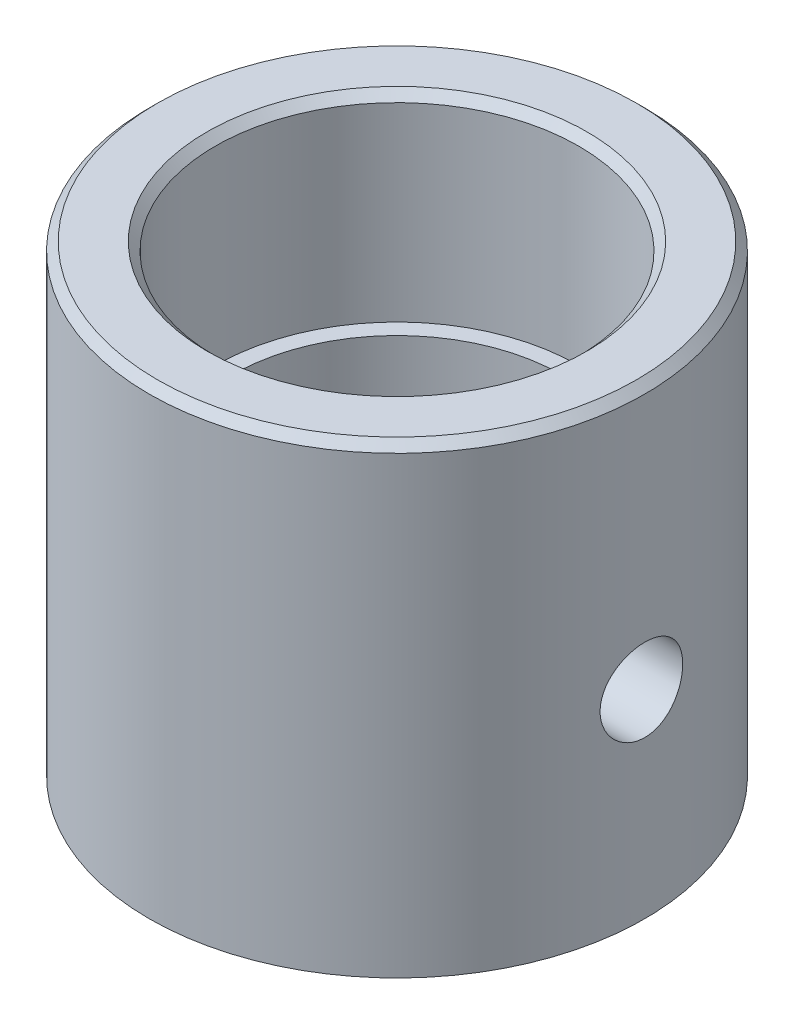
ISO-10303-21;
HEADER;
FILE_DESCRIPTION(('STEP AP214'),'2;1');
FILE_NAME('part.step','',(''),(''),'','','');
FILE_SCHEMA(('AUTOMOTIVE_DESIGN { 1 0 10303 214 1 1 1 1 }'));
ENDSEC;
DATA;
#1=APPLICATION_CONTEXT('core data for automotive mechanical design processes');
#2=APPLICATION_PROTOCOL_DEFINITION('international standard','automotive_design',2000,#1);
#3=PRODUCT_CONTEXT('',#1,'mechanical');
#4=PRODUCT('Part','Part','',(#3));
#5=PRODUCT_RELATED_PRODUCT_CATEGORY('part','',(#4));
#6=PRODUCT_DEFINITION_FORMATION('','',#4);
#7=PRODUCT_DEFINITION_CONTEXT('part definition',#1,'design');
#8=PRODUCT_DEFINITION('design','',#6,#7);
#9=PRODUCT_DEFINITION_SHAPE('','',#8);
#10=(LENGTH_UNIT() NAMED_UNIT(*) SI_UNIT(.MILLI.,.METRE.));
#11=(NAMED_UNIT(*) PLANE_ANGLE_UNIT() SI_UNIT($,.RADIAN.));
#12=(NAMED_UNIT(*) SI_UNIT($,.STERADIAN.) SOLID_ANGLE_UNIT());
#13=UNCERTAINTY_MEASURE_WITH_UNIT(LENGTH_MEASURE(1.E-05),#10,'distance_accuracy_value','');
#14=(GEOMETRIC_REPRESENTATION_CONTEXT(3) GLOBAL_UNCERTAINTY_ASSIGNED_CONTEXT((#13)) GLOBAL_UNIT_ASSIGNED_CONTEXT((#10,
#11,#12)) REPRESENTATION_CONTEXT('',''));
#15=CARTESIAN_POINT('',(0.,0.,0.));
#16=DIRECTION('',(0.,0.,1.));
#17=DIRECTION('',(1.,0.,0.));
#18=AXIS2_PLACEMENT_3D('',#15,#16,#17);
#19=CARTESIAN_POINT('',(0.,28.,0.));
#20=DIRECTION('',(0.,-1.,0.));
#21=DIRECTION('',(0.,0.,-1.));
#22=AXIS2_PLACEMENT_3D('',#19,#20,#21);
#23=CYLINDRICAL_SURFACE('',#22,15.);
#24=CARTESIAN_POINT('',(0.,27.5,0.));
#25=DIRECTION('',(0.,1.,0.));
#26=DIRECTION('',(0.,0.,1.));
#27=AXIS2_PLACEMENT_3D('',#24,#25,#26);
#28=CIRCLE('',#27,15.);
#29=CARTESIAN_POINT('',(0.,27.5,15.));
#30=VERTEX_POINT('',#29);
#31=EDGE_CURVE('E10',#30,#30,#28,.F.);
#32=ORIENTED_EDGE('',*,*,#31,.T.);
#33=EDGE_LOOP('',(#32));
#34=FACE_BOUND('',#33,.T.);
#35=CARTESIAN_POINT('',(-15.,9.5,0.));
#36=CARTESIAN_POINT('',(-14.9999976116882,9.50000558894782,-0.139390904958215));
#37=CARTESIAN_POINT('',(-14.9980367791303,9.51169727496892,-0.278857881838821));
#38=CARTESIAN_POINT('',(-14.9904034494139,9.55813565876533,-0.553880221673043));
#39=CARTESIAN_POINT('',(-14.9847275392389,9.5929035569116,-0.689431867959247));
#40=CARTESIAN_POINT('',(-14.9703006823645,9.68441544859275,-0.952604747212644));
#41=CARTESIAN_POINT('',(-14.9615522515919,9.74114146564057,-1.0802323684319));
#42=CARTESIAN_POINT('',(-14.9419422708207,9.87491229205239,-1.32414184197795));
#43=CARTESIAN_POINT('',(-14.9310809625443,9.951954777483,-1.44042498987859));
#44=CARTESIAN_POINT('',(-14.9083331745831,10.1249550838205,-1.65947261429168));
#45=CARTESIAN_POINT('',(-14.8964387181486,10.2210691146361,-1.76211290353497));
#46=CARTESIAN_POINT('',(-14.8730262687673,10.4291479684728,-1.94988849865993));
#47=CARTESIAN_POINT('',(-14.8615082996267,10.5411137914566,-2.03502269939097));
#48=CARTESIAN_POINT('',(-14.8400756575978,10.7785709661971,-2.18586712560513));
#49=CARTESIAN_POINT('',(-14.8301712909164,10.9041413368048,-2.251454552861));
#50=CARTESIAN_POINT('',(-14.8131978979467,11.1647095643006,-2.36055836541122));
#51=CARTESIAN_POINT('',(-14.8061286801431,11.2997067836776,-2.40407624156561));
#52=CARTESIAN_POINT('',(-14.7957053684276,11.5739802748565,-2.46741437778481));
#53=CARTESIAN_POINT('',(-14.792317684857,11.7132057365014,-2.4874490291354));
#54=CARTESIAN_POINT('',(-14.7895393893665,11.9930802768835,-2.50391672528988));
#55=CARTESIAN_POINT('',(-14.7901484945721,12.1337292541673,-2.500351440389));
#56=CARTESIAN_POINT('',(-14.7952642886355,12.4109278612754,-2.46989509839615));
#57=CARTESIAN_POINT('',(-14.7997307331892,12.5475048035452,-2.44324488188977));
#58=CARTESIAN_POINT('',(-14.8119949521101,12.8142213178291,-2.36775314040345));
#59=CARTESIAN_POINT('',(-14.8197928407327,12.9443606688885,-2.31891085431974));
#60=CARTESIAN_POINT('',(-14.837884793341,13.1952288234409,-2.20017724609391));
#61=CARTESIAN_POINT('',(-14.8481906710733,13.3159094060812,-2.13018591387971));
#62=CARTESIAN_POINT('',(-14.8701291841501,13.5439044005384,-1.97121201755743));
#63=CARTESIAN_POINT('',(-14.8817619265429,13.6512177324549,-1.88222792065429));
#64=CARTESIAN_POINT('',(-14.9052202787979,13.8508260858073,-1.68648221215905));
#65=CARTESIAN_POINT('',(-14.9170464923165,13.9429185185401,-1.57951396387313));
#66=CARTESIAN_POINT('',(-14.9394260139672,14.1078777626653,-1.35153524898165));
#67=CARTESIAN_POINT('',(-14.9499793138975,14.1807444501832,-1.23052469190642));
#68=CARTESIAN_POINT('',(-14.9686389289291,14.3052022271363,-0.977705916166711));
#69=CARTESIAN_POINT('',(-14.9767431840745,14.3567754193313,-0.845888725564662));
#70=CARTESIAN_POINT('',(-14.9895750301266,14.436994215246,-0.575298345602731));
#71=CARTESIAN_POINT('',(-14.9943029035047,14.4656417369737,-0.436525739179468));
#72=CARTESIAN_POINT('',(-14.9998112984269,14.4989213584611,-0.157709901301624));
#73=CARTESIAN_POINT('',(-15.0006375301278,14.5038315718056,-0.0177007371510119));
#74=CARTESIAN_POINT('',(-14.9983747442117,14.4902386555719,0.261139772889886));
#75=CARTESIAN_POINT('',(-14.9952858772412,14.4717364268663,0.399971163892038));
#76=CARTESIAN_POINT('',(-14.985568269382,14.4120751506645,0.671656175546763));
#77=CARTESIAN_POINT('',(-14.9789610480131,14.3710537916099,0.804540868385379));
#78=CARTESIAN_POINT('',(-14.9629446445536,14.2676654818005,1.06154688486044));
#79=CARTESIAN_POINT('',(-14.9535353051202,14.2052973323647,1.18566771590972));
#80=CARTESIAN_POINT('',(-14.9328451630241,14.0603488753032,1.42283068946896));
#81=CARTESIAN_POINT('',(-14.9215485588702,13.9775948438327,1.53576525093715));
#82=CARTESIAN_POINT('',(-14.898384673919,13.7944626846149,1.74624358550269));
#83=CARTESIAN_POINT('',(-14.8865173517155,13.6940832767233,1.84378623969658));
#84=CARTESIAN_POINT('',(-14.8634017523585,13.4773024519286,2.021742779658));
#85=CARTESIAN_POINT('',(-14.8521611613711,13.3607458344856,2.10196876111372));
#86=CARTESIAN_POINT('',(-14.8317152977788,13.1156470308615,2.24170231029499));
#87=CARTESIAN_POINT('',(-14.8225099606602,12.9871052247725,2.30121053476982));
#88=CARTESIAN_POINT('',(-14.807234536977,12.7222102671879,2.39753833147315));
#89=CARTESIAN_POINT('',(-14.8011515431106,12.5858919049695,2.43445143254795));
#90=CARTESIAN_POINT('',(-14.7927771683526,12.3088798707782,2.48483545377828));
#91=CARTESIAN_POINT('',(-14.7904854578272,12.1681865802679,2.49830841194617));
#92=CARTESIAN_POINT('',(-14.7899673308401,11.8882948340376,2.50137286604735));
#93=CARTESIAN_POINT('',(-14.7916905650565,11.7490996214247,2.49126013612519));
#94=CARTESIAN_POINT('',(-14.7988978145373,11.4744207519492,2.44807983895685));
#95=CARTESIAN_POINT('',(-14.8043818176121,11.3389370830581,2.41501234611248));
#96=CARTESIAN_POINT('',(-14.8184735628172,11.0756415627074,2.3269744895949));
#97=CARTESIAN_POINT('',(-14.8270776721967,10.947820989944,2.27202959060044));
#98=CARTESIAN_POINT('',(-14.8464436892221,10.7031643308052,2.14182700391591));
#99=CARTESIAN_POINT('',(-14.857205703884,10.5863287896279,2.06656830874856));
#100=CARTESIAN_POINT('',(-14.8798345404562,10.3654644168922,1.89681888437216));
#101=CARTESIAN_POINT('',(-14.891712955763,10.2616039832997,1.80211056359365));
#102=CARTESIAN_POINT('',(-14.9151437236084,10.0711483955251,1.59660903138023));
#103=CARTESIAN_POINT('',(-14.9266960002655,9.98455723136183,1.48581211291264));
#104=CARTESIAN_POINT('',(-14.9482652964222,9.83055173180006,1.25036916964028));
#105=CARTESIAN_POINT('',(-14.958271162531,9.76327396068705,1.12563278753282));
#106=CARTESIAN_POINT('',(-14.9755116760178,9.65073051539008,0.866513069378983));
#107=CARTESIAN_POINT('',(-14.9827490817748,9.6054429189203,0.732139494830011));
#108=CARTESIAN_POINT('',(-14.9920579083296,9.54799472587333,0.497703310045401));
#109=CARTESIAN_POINT('',(-14.9950202727336,9.53002553038404,0.399058830298448));
#110=CARTESIAN_POINT('',(-14.9989921598612,9.50602626215525,0.200289310319809));
#111=CARTESIAN_POINT('',(-15.0000017162064,9.49999598386264,0.100164295608494));
#112=CARTESIAN_POINT('',(-15.,9.5,0.));
#113=B_SPLINE_CURVE_WITH_KNOTS('',3,(#35,#36,#37,#38,#39,#40,#41,#42,#43,#44,#45,#46,#47,#48,
#49,#50,#51,#52,#53,#54,#55,#56,#57,#58,#59,#60,#61,#62,#63,#64,#65,#66,#67,#68,#69,#70,#71,#72,
#73,#74,#75,#76,#77,#78,#79,#80,#81,#82,#83,#84,#85,#86,#87,#88,#89,#90,#91,#92,#93,#94,#95,#96,
#97,#98,#99,#100,#101,#102,#103,#104,#105,#106,#107,#108,#109,#110,#111,#112),.UNSPECIFIED.,.T.,
.F.,(4,2,2,2,2,2,2,2,2,2,2,2,2,2,2,2,2,2,2,2,2,2,2,2,2,2,2,2,2,2,2,2,2,2,2,2,2,2,4),(0.,
0.41780658493851,0.835997545695421,1.25384686702527,1.67164841267479,2.09302491062332,
2.51442800169857,2.9384252082384,3.36239376876181,3.78246077103424,4.20249804320887,
4.61820521760408,5.03392665025381,5.45164556632558,5.86939820680574,6.29232769911327,
6.71525991635848,7.13854688915904,7.56179844521149,7.98007883491397,8.3983431303586,
8.81407807006416,9.22983635826067,9.64926825627024,10.0687306305428,10.4925382200762,
10.9163323737594,11.3383602234177,11.7603513778662,12.177079095227,12.5938054618813,
13.0100481822622,13.4263115502934,13.8475138419339,14.2688133387897,14.693022316072,
15.1168075213007,15.4170424816402,15.7172722727697),.UNSPECIFIED.);
#114=CARTESIAN_POINT('',(-15.,9.5,0.));
#115=VERTEX_POINT('',#114);
#116=EDGE_CURVE('E103',#115,#115,#113,.T.);
#117=ORIENTED_EDGE('',*,*,#116,.T.);
#118=EDGE_LOOP('',(#117));
#119=FACE_BOUND('',#118,.T.);
#120=CARTESIAN_POINT('',(14.790199457749,12.,-2.5));
#121=CARTESIAN_POINT('',(14.790201973666,11.8606242518382,-2.49999439841983));
#122=CARTESIAN_POINT('',(14.7921909238523,11.7211723939285,-2.48830516902828));
#123=CARTESIAN_POINT('',(14.7999245720004,11.4461814567368,-2.44187742806638));
#124=CARTESIAN_POINT('',(14.8056727334637,11.3106461062419,-2.40711766030861));
#125=CARTESIAN_POINT('',(14.8202560936731,11.0475077166584,-2.31562954367049));
#126=CARTESIAN_POINT('',(14.8290887118401,10.9198981513378,-2.25891955493199));
#127=CARTESIAN_POINT('',(14.8488427210228,10.6760190452822,-2.12518649688947));
#128=CARTESIAN_POINT('',(14.8597638769423,10.5597482304227,-2.04816571350133));
#129=CARTESIAN_POINT('',(14.8825847115588,10.3406871502554,-1.87518752696654));
#130=CARTESIAN_POINT('',(14.8944921732795,10.2380248686138,-1.77906904893234));
#131=CARTESIAN_POINT('',(14.9178748066858,10.0502066931382,-1.57097200469528));
#132=CARTESIAN_POINT('',(14.9293499527174,9.96505183688458,-1.45899249914997));
#133=CARTESIAN_POINT('',(14.9506573698271,9.81418543278073,-1.22152286994836));
#134=CARTESIAN_POINT('',(14.9604794243234,9.7485929922682,-1.09595608145671));
#135=CARTESIAN_POINT('',(14.9772873695709,9.63947892946945,-0.83539562172387));
#136=CARTESIAN_POINT('',(14.9842734447266,9.59595587211512,-0.70040256407819));
#137=CARTESIAN_POINT('',(14.994567347244,9.5326074650161,-0.426143726344244));
#138=CARTESIAN_POINT('',(14.9979085311091,9.51256708399531,-0.286928886679272));
#139=CARTESIAN_POINT('',(15.0006507934278,9.4960842458474,-0.00707528552579839));
#140=CARTESIAN_POINT('',(15.0000521396931,9.49964018475277,0.133563378528897));
#141=CARTESIAN_POINT('',(14.9950085843139,9.53008135152821,0.410802185078875));
#142=CARTESIAN_POINT('',(14.990601836924,9.55673516340915,0.54742853070014));
#143=CARTESIAN_POINT('',(14.9784797877164,9.63225107424649,0.81424197961179));
#144=CARTESIAN_POINT('',(14.9707643851321,9.6811138495895,0.944428886651503));
#145=CARTESIAN_POINT('',(14.9528269851196,9.79989064031532,1.19535614778265));
#146=CARTESIAN_POINT('',(14.9425936732688,9.86990001208244,1.31605052301904));
#147=CARTESIAN_POINT('',(14.920757380715,10.028912822635,1.54406552984664));
#148=CARTESIAN_POINT('',(14.9091542891913,10.1179177987108,1.65138507791588));
#149=CARTESIAN_POINT('',(14.885702682326,10.3136788066193,1.85097127344667));
#150=CARTESIAN_POINT('',(14.8738528973104,10.420637094901,1.94303950225321));
#151=CARTESIAN_POINT('',(14.8513795978481,10.6485870902158,2.10795458844806));
#152=CARTESIAN_POINT('',(14.8407560947132,10.7695789266828,2.18080126853242));
#153=CARTESIAN_POINT('',(14.8219375456182,11.0223916418775,2.30524443448829));
#154=CARTESIAN_POINT('',(14.813745233026,11.1542244980921,2.35681702727924));
#155=CARTESIAN_POINT('',(14.8007618868988,11.4248490723075,2.43702987081562));
#156=CARTESIAN_POINT('',(14.7959705538832,11.5636401764324,2.46567214076796));
#157=CARTESIAN_POINT('',(14.7903895942212,11.8424661561621,2.49893188487927));
#158=CARTESIAN_POINT('',(14.7895528575867,11.9824663797021,2.50383220791244));
#159=CARTESIAN_POINT('',(14.7918503478236,12.2612866716908,2.49022270268246));
#160=CARTESIAN_POINT('',(14.7949844213185,12.400106785514,2.47171377862467));
#161=CARTESIAN_POINT('',(14.8048268745502,12.6717277591909,2.4120523349281));
#162=CARTESIAN_POINT('',(14.8115125191835,12.804561139878,2.37104379064639));
#163=CARTESIAN_POINT('',(14.827685730055,13.0614701662795,2.26769819019228));
#164=CARTESIAN_POINT('',(14.8371734639058,13.1855452875509,2.20535985810094));
#165=CARTESIAN_POINT('',(14.8579912839739,13.4226745944061,2.06045667322923));
#166=CARTESIAN_POINT('',(14.8693375560035,13.5356165727561,1.97771056415936));
#167=CARTESIAN_POINT('',(14.8925466667987,13.746113532695,1.79458946570798));
#168=CARTESIAN_POINT('',(14.9044095418533,13.8436674311097,1.69421323638405));
#169=CARTESIAN_POINT('',(14.9274642211826,14.0216518927287,1.47742807032881));
#170=CARTESIAN_POINT('',(14.9386477634467,14.1018938262845,1.3608632533862));
#171=CARTESIAN_POINT('',(14.9589511243294,14.2416553270049,1.11574344794933));
#172=CARTESIAN_POINT('',(14.9680710096998,14.3011755644739,0.987188847470628));
#173=CARTESIAN_POINT('',(14.9831835816958,14.3975105839549,0.72229905150133));
#174=CARTESIAN_POINT('',(14.9891898456762,14.4344240757349,0.586000562602613));
#175=CARTESIAN_POINT('',(14.9974558316928,14.4848155989638,0.309030734874213));
#176=CARTESIAN_POINT('',(14.9997158620019,14.4982955587324,0.168359756821622));
#177=CARTESIAN_POINT('',(15.0002303788781,14.5013818823122,-0.111541275773675));
#178=CARTESIAN_POINT('',(14.9985330202419,14.4912752539411,-0.250768160602662));
#179=CARTESIAN_POINT('',(14.9914217838733,14.4480960777306,-0.525511974314703));
#180=CARTESIAN_POINT('',(14.9860079269518,14.4150236584903,-0.661028923967478));
#181=CARTESIAN_POINT('',(14.972069888274,14.3269618344564,-0.924396445918536));
#182=CARTESIAN_POINT('',(14.9635491704088,14.27199683179,-1.05225537215382));
#183=CARTESIAN_POINT('',(14.9443275687803,14.1417420637694,-1.29698045298217));
#184=CARTESIAN_POINT('',(14.9336265816741,14.0664513349376,-1.41384608611822));
#185=CARTESIAN_POINT('',(14.9110762961641,13.8966649075395,-1.63471294552639));
#186=CARTESIAN_POINT('',(14.8992152454112,13.8019590452487,-1.73855143060275));
#187=CARTESIAN_POINT('',(14.8757630331437,13.5964716920962,-1.92896387595091));
#188=CARTESIAN_POINT('',(14.8641719354951,13.4856864410875,-2.0155337867119));
#189=CARTESIAN_POINT('',(14.8424834353391,13.2502546775104,-2.16951427091086));
#190=CARTESIAN_POINT('',(14.8323971784578,13.1255156602345,-2.2367849890577));
#191=CARTESIAN_POINT('',(14.8149921009131,12.8663907641619,-2.34931453640427));
#192=CARTESIAN_POINT('',(14.8076705172488,12.7320146773226,-2.39459535522307));
#193=CARTESIAN_POINT('',(14.7982474485649,12.4975962305126,-2.45202605312742));
#194=CARTESIAN_POINT('',(14.7952462341947,12.3989731920374,-2.46998741767139));
#195=CARTESIAN_POINT('',(14.7912213528807,12.2002465151631,-2.49397629518131));
#196=CARTESIAN_POINT('',(14.7901976500369,12.1001429036758,-2.50000402479277));
#197=CARTESIAN_POINT('',(14.790199457749,12.,-2.5));
#198=B_SPLINE_CURVE_WITH_KNOTS('',3,(#120,#121,#122,#123,#124,#125,#126,#127,#128,#129,#130,
#131,#132,#133,#134,#135,#136,#137,#138,#139,#140,#141,#142,#143,#144,#145,#146,#147,#148,#149,
#150,#151,#152,#153,#154,#155,#156,#157,#158,#159,#160,#161,#162,#163,#164,#165,#166,#167,#168,
#169,#170,#171,#172,#173,#174,#175,#176,#177,#178,#179,#180,#181,#182,#183,#184,#185,#186,#187,
#188,#189,#190,#191,#192,#193,#194,#195,#196,#197),.UNSPECIFIED.,.T.,.F.,(4,2,2,2,2,2,2,2,2,2,2,
2,2,2,2,2,2,2,2,2,2,2,2,2,2,2,2,2,2,2,2,2,2,2,2,2,2,2,4),(0.,0.41776103892774,0.83590751996297,
1.25370499787519,1.67145547405274,2.09289159155714,2.51435267834447,2.93832980111435,
3.36227935111113,3.78231567472565,4.20232344652692,4.61817121164668,5.03403164249533,
5.45179604139425,5.86959426226764,6.29246123462123,6.71533210746019,7.13867662498604,
7.56198385938077,7.98023542420411,8.39847083413976,8.81406064635492,9.22967532293575,
9.64912342762702,10.0686010443069,10.4924411303538,10.916267504767,11.3382298441765,
11.7601574591235,12.1769777626592,12.5937957321882,13.0101503983246,13.4265248039234,
13.8476699746325,14.2689137888181,14.6931372761832,15.1169356674445,15.4171067054377,
15.7172722940182),.UNSPECIFIED.);
#199=CARTESIAN_POINT('',(14.790199457749,12.,-2.5));
#200=VERTEX_POINT('',#199);
#201=EDGE_CURVE('E73',#200,#200,#198,.T.);
#202=ORIENTED_EDGE('',*,*,#201,.T.);
#203=EDGE_LOOP('',(#202));
#204=FACE_BOUND('',#203,.T.);
#205=CARTESIAN_POINT('',(0.,0.,0.));
#206=DIRECTION('',(0.,1.,0.));
#207=DIRECTION('',(0.,0.,1.));
#208=AXIS2_PLACEMENT_3D('',#205,#206,#207);
#209=CIRCLE('',#208,15.);
#210=CARTESIAN_POINT('',(0.,0.,15.));
#211=VERTEX_POINT('',#210);
#212=EDGE_CURVE('E63',#211,#211,#209,.T.);
#213=ORIENTED_EDGE('',*,*,#212,.T.);
#214=EDGE_LOOP('',(#213));
#215=FACE_BOUND('',#214,.T.);
#216=ADVANCED_FACE('F38',(#34,#119,#204,#215),#23,.T.);
#217=CARTESIAN_POINT('',(0.,28.,0.));
#218=DIRECTION('',(0.,1.,0.));
#219=DIRECTION('',(0.,0.,1.));
#220=AXIS2_PLACEMENT_3D('',#217,#218,#219);
#221=PLANE('',#220);
#222=CARTESIAN_POINT('',(0.,28.,0.));
#223=DIRECTION('',(0.,1.,0.));
#224=DIRECTION('',(0.,0.,1.));
#225=AXIS2_PLACEMENT_3D('',#222,#223,#224);
#226=CIRCLE('',#225,11.5);
#227=CARTESIAN_POINT('',(0.,28.,11.5));
#228=VERTEX_POINT('',#227);
#229=EDGE_CURVE('E47',#228,#228,#226,.F.);
#230=ORIENTED_EDGE('',*,*,#229,.T.);
#231=EDGE_LOOP('',(#230));
#232=FACE_BOUND('',#231,.T.);
#233=CARTESIAN_POINT('',(0.,28.,0.));
#234=DIRECTION('',(0.,1.,0.));
#235=DIRECTION('',(0.,0.,1.));
#236=AXIS2_PLACEMENT_3D('',#233,#234,#235);
#237=CIRCLE('',#236,14.5);
#238=CARTESIAN_POINT('',(0.,28.,14.5));
#239=VERTEX_POINT('',#238);
#240=EDGE_CURVE('E52',#239,#239,#237,.T.);
#241=ORIENTED_EDGE('',*,*,#240,.T.);
#242=EDGE_LOOP('',(#241));
#243=FACE_BOUND('',#242,.T.);
#244=ADVANCED_FACE('F111',(#232,#243),#221,.T.);
#245=CARTESIAN_POINT('',(0.,0.,0.));
#246=DIRECTION('',(0.,1.,0.));
#247=DIRECTION('',(0.,0.,1.));
#248=AXIS2_PLACEMENT_3D('',#245,#246,#247);
#249=PLANE('',#248);
#250=ORIENTED_EDGE('',*,*,#212,.F.);
#251=EDGE_LOOP('',(#250));
#252=FACE_BOUND('',#251,.T.);
#253=ADVANCED_FACE('F112',(#252),#249,.F.);
#254=CARTESIAN_POINT('',(0.,16.,0.));
#255=DIRECTION('',(0.,1.,0.));
#256=DIRECTION('',(0.,0.,1.));
#257=AXIS2_PLACEMENT_3D('',#254,#255,#256);
#258=PLANE('',#257);
#259=CARTESIAN_POINT('',(0.,16.,0.));
#260=DIRECTION('',(0.,1.,0.));
#261=DIRECTION('',(0.,0.,1.));
#262=AXIS2_PLACEMENT_3D('',#259,#260,#261);
#263=CIRCLE('',#262,11.);
#264=CARTESIAN_POINT('',(0.,16.,11.));
#265=VERTEX_POINT('',#264);
#266=EDGE_CURVE('E132',#265,#265,#263,.T.);
#267=ORIENTED_EDGE('',*,*,#266,.T.);
#268=EDGE_LOOP('',(#267));
#269=FACE_BOUND('',#268,.T.);
#270=CARTESIAN_POINT('',(0.,16.,0.));
#271=DIRECTION('',(0.,1.,0.));
#272=DIRECTION('',(0.,0.,1.));
#273=AXIS2_PLACEMENT_3D('',#270,#271,#272);
#274=CIRCLE('',#273,10.);
#275=CARTESIAN_POINT('',(0.,16.,10.));
#276=VERTEX_POINT('',#275);
#277=EDGE_CURVE('E135',#276,#276,#274,.F.);
#278=ORIENTED_EDGE('',*,*,#277,.T.);
#279=EDGE_LOOP('',(#278));
#280=FACE_BOUND('',#279,.T.);
#281=ADVANCED_FACE('F90',(#269,#280),#258,.T.);
#282=CARTESIAN_POINT('',(0.,16.,0.));
#283=DIRECTION('',(0.,1.,0.));
#284=DIRECTION('',(0.,0.,1.));
#285=AXIS2_PLACEMENT_3D('',#282,#283,#284);
#286=CYLINDRICAL_SURFACE('',#285,11.);
#287=CARTESIAN_POINT('',(0.,27.5,0.));
#288=DIRECTION('',(0.,1.,0.));
#289=DIRECTION('',(0.,0.,1.));
#290=AXIS2_PLACEMENT_3D('',#287,#288,#289);
#291=CIRCLE('',#290,11.);
#292=CARTESIAN_POINT('',(0.,27.5,11.));
#293=VERTEX_POINT('',#292);
#294=EDGE_CURVE('E57',#293,#293,#291,.T.);
#295=ORIENTED_EDGE('',*,*,#294,.T.);
#296=EDGE_LOOP('',(#295));
#297=FACE_BOUND('',#296,.T.);
#298=ORIENTED_EDGE('',*,*,#266,.F.);
#299=EDGE_LOOP('',(#298));
#300=FACE_BOUND('',#299,.T.);
#301=ADVANCED_FACE('F126',(#297,#300),#286,.F.);
#302=CARTESIAN_POINT('',(0.,1.,0.));
#303=DIRECTION('',(0.,1.,0.));
#304=DIRECTION('',(0.,0.,1.));
#305=AXIS2_PLACEMENT_3D('',#302,#303,#304);
#306=PLANE('',#305);
#307=CARTESIAN_POINT('',(0.,1.,0.));
#308=DIRECTION('',(0.,1.,0.));
#309=DIRECTION('',(0.,0.,1.));
#310=AXIS2_PLACEMENT_3D('',#307,#308,#309);
#311=CIRCLE('',#310,10.);
#312=CARTESIAN_POINT('',(0.,1.,10.));
#313=VERTEX_POINT('',#312);
#314=EDGE_CURVE('E139',#313,#313,#311,.T.);
#315=ORIENTED_EDGE('',*,*,#314,.T.);
#316=EDGE_LOOP('',(#315));
#317=FACE_BOUND('',#316,.T.);
#318=ADVANCED_FACE('F129',(#317),#306,.T.);
#319=CARTESIAN_POINT('',(0.,1.,0.));
#320=DIRECTION('',(0.,1.,0.));
#321=DIRECTION('',(0.,0.,1.));
#322=AXIS2_PLACEMENT_3D('',#319,#320,#321);
#323=CYLINDRICAL_SURFACE('',#322,10.);
#324=CARTESIAN_POINT('',(-9.68245836551854,12.,-2.5));
#325=CARTESIAN_POINT('',(-9.6824610008786,11.8619492490734,-2.49999607859307));
#326=CARTESIAN_POINT('',(-9.68544306014597,11.7238551013215,-2.48852624549765));
#327=CARTESIAN_POINT('',(-9.69701861992564,11.4516324218265,-2.44302312546379));
#328=CARTESIAN_POINT('',(-9.7056153862163,11.3175062455318,-2.40897670674211));
#329=CARTESIAN_POINT('',(-9.7273872459615,11.0571964618128,-2.31949119963204));
#330=CARTESIAN_POINT('',(-9.74055642690458,10.9310028446143,-2.26407972785449));
#331=CARTESIAN_POINT('',(-9.76998192028759,10.6896891474601,-2.13352114126138));
#332=CARTESIAN_POINT('',(-9.78623836378489,10.5745695379198,-2.05837318856069));
#333=CARTESIAN_POINT('',(-9.82040716355625,10.3561383547378,-1.88870842731188));
#334=CARTESIAN_POINT('',(-9.83834597623034,10.25310639965,-1.79383688770405));
#335=CARTESIAN_POINT('',(-9.87362875515294,10.0642386056397,-1.58818206410066));
#336=CARTESIAN_POINT('',(-9.89097266566388,9.97840437437825,-1.47739729418031));
#337=CARTESIAN_POINT('',(-9.92340415520582,9.82522453236872,-1.24114520107896));
#338=CARTESIAN_POINT('',(-9.93845687400592,9.75815361183853,-1.11549457619512));
#339=CARTESIAN_POINT('',(-9.96430811925984,9.64619035584692,-0.854263184292763));
#340=CARTESIAN_POINT('',(-9.97510727334345,9.60129474808449,-0.718683885791941));
#341=CARTESIAN_POINT('',(-9.9910475884818,9.53585216542142,-0.444358758754162));
#342=CARTESIAN_POINT('',(-9.99629893844314,9.51483035567342,-0.305732719548976));
#343=CARTESIAN_POINT('',(-10.000935941073,9.49624162072445,-0.0268288192627702));
#344=CARTESIAN_POINT('',(-10.000322460967,9.4986712277904,0.113448794538067));
#345=CARTESIAN_POINT('',(-9.99338094953534,9.52657485025014,0.388380617930967));
#346=CARTESIAN_POINT('',(-9.98718002340871,9.55153632505385,0.523090539002667));
#347=CARTESIAN_POINT('',(-9.96990836524857,9.6229712700485,0.786345618534215));
#348=CARTESIAN_POINT('',(-9.95883737398452,9.66944588537741,0.914890448426094));
#349=CARTESIAN_POINT('',(-9.93287509700884,9.78300257068706,1.16351675875452));
#350=CARTESIAN_POINT('',(-9.91795019695011,9.85026704466174,1.28351127441626));
#351=CARTESIAN_POINT('',(-9.88589903809692,10.0033556791163,1.51068905585122));
#352=CARTESIAN_POINT('',(-9.8687723965265,10.0891830685606,1.61787008771377));
#353=CARTESIAN_POINT('',(-9.83363713769356,10.2797087419824,1.81943508771239));
#354=CARTESIAN_POINT('',(-9.81561719525297,10.3848548923477,1.91339419768799));
#355=CARTESIAN_POINT('',(-9.78115043517327,10.6095999735403,2.08244093990755));
#356=CARTESIAN_POINT('',(-9.76470369108289,10.7291995794911,2.15752769011507));
#357=CARTESIAN_POINT('',(-9.73520496829319,10.9802900341489,2.28697032255647));
#358=CARTESIAN_POINT('',(-9.72216983717007,11.1118357303128,2.34122391742613));
#359=CARTESIAN_POINT('',(-9.70118640148669,11.3825854680768,2.42671405159096));
#360=CARTESIAN_POINT('',(-9.69323700842733,11.5217878639846,2.45795551638266));
#361=CARTESIAN_POINT('',(-9.68355356007457,11.7999595015299,2.49582963866592));
#362=CARTESIAN_POINT('',(-9.68166088976933,11.938837793341,2.50309047391912));
#363=CARTESIAN_POINT('',(-9.68387343364692,12.2158219365853,2.49451699051516));
#364=CARTESIAN_POINT('',(-9.687978095703,12.3539278579494,2.4786847978498));
#365=CARTESIAN_POINT('',(-9.70157081984979,12.6231142649486,2.42492546393825));
#366=CARTESIAN_POINT('',(-9.71096970242531,12.7542727265692,2.3873640682819));
#367=CARTESIAN_POINT('',(-9.73400718262805,13.0084314578533,2.29161808167046));
#368=CARTESIAN_POINT('',(-9.74764628246408,13.1314307590558,2.2334310477125));
#369=CARTESIAN_POINT('',(-9.77796137095511,13.3684412778669,2.0967706679366));
#370=CARTESIAN_POINT('',(-9.79469168607245,13.482228840043,2.01792175383564));
#371=CARTESIAN_POINT('',(-9.82917083071112,13.6951883628015,1.84265073233613));
#372=CARTESIAN_POINT('',(-9.84691982728307,13.7943579166501,1.7462257370136));
#373=CARTESIAN_POINT('',(-9.88197403031774,13.9778110425709,1.53565680246182));
#374=CARTESIAN_POINT('',(-9.8992570206188,14.0616600625488,1.42112988132898));
#375=CARTESIAN_POINT('',(-9.93097216613689,14.2089358669513,1.17925670673669));
#376=CARTESIAN_POINT('',(-9.94540447003949,14.2723637166082,1.05191112239398));
#377=CARTESIAN_POINT('',(-9.96970115738325,14.3764460345279,0.788895504327729));
#378=CARTESIAN_POINT('',(-9.97959830022409,14.4172642843791,0.653293452569708));
#379=CARTESIAN_POINT('',(-9.99385293395789,14.4754603346084,0.37687440079702));
#380=CARTESIAN_POINT('',(-9.99821149393422,14.492842658739,0.236058412603104));
#381=CARTESIAN_POINT('',(-10.0008542352202,14.5034189739388,-0.0427088161083059));
#382=CARTESIAN_POINT('',(-9.99929947199971,14.4972542727385,-0.180634567415053));
#383=CARTESIAN_POINT('',(-9.99064741143608,14.4623804317641,-0.453418741036876));
#384=CARTESIAN_POINT('',(-9.98355027892922,14.4336719624671,-0.58827725445232));
#385=CARTESIAN_POINT('',(-9.96463582134723,14.3548694505728,-0.850427589111933));
#386=CARTESIAN_POINT('',(-9.95284411255981,14.3048913667141,-0.977756236452155));
#387=CARTESIAN_POINT('',(-9.92578222284145,14.1850735524511,-1.22229263260406));
#388=CARTESIAN_POINT('',(-9.91051160346894,14.1152313183238,-1.33949910316408));
#389=CARTESIAN_POINT('',(-9.87768124200718,13.9557119150097,-1.56350482105826));
#390=CARTESIAN_POINT('',(-9.86007542354161,13.8655996427404,-1.66998747074584));
#391=CARTESIAN_POINT('',(-9.82476622642974,13.6689428700566,-1.86653755068376));
#392=CARTESIAN_POINT('',(-9.80706282418256,13.5623942097221,-1.95660081269147));
#393=CARTESIAN_POINT('',(-9.77318689613756,13.3334964645264,-2.11940506617958));
#394=CARTESIAN_POINT('',(-9.75704909183222,13.2108896915869,-2.19179154854095));
#395=CARTESIAN_POINT('',(-9.7285988873707,12.954861275313,-2.31481724146367));
#396=CARTESIAN_POINT('',(-9.71628370583034,12.8214475847654,-2.36547227438038));
#397=CARTESIAN_POINT('',(-9.69879771876843,12.5735574704121,-2.43605632142751));
#398=CARTESIAN_POINT('',(-9.69271657508747,12.4602670890347,-2.4599829264922));
#399=CARTESIAN_POINT('',(-9.6845459645655,12.2313278275058,-2.49195573142942));
#400=CARTESIAN_POINT('',(-9.68245615722769,12.115679149389,-2.50000328592938));
#401=CARTESIAN_POINT('',(-9.68245836551854,12.,-2.5));
#402=B_SPLINE_CURVE_WITH_KNOTS('',3,(#324,#325,#326,#327,#328,#329,#330,#331,#332,#333,#334,
#335,#336,#337,#338,#339,#340,#341,#342,#343,#344,#345,#346,#347,#348,#349,#350,#351,#352,#353,
#354,#355,#356,#357,#358,#359,#360,#361,#362,#363,#364,#365,#366,#367,#368,#369,#370,#371,#372,
#373,#374,#375,#376,#377,#378,#379,#380,#381,#382,#383,#384,#385,#386,#387,#388,#389,#390,#391,
#392,#393,#394,#395,#396,#397,#398,#399,#400,#401),.UNSPECIFIED.,.T.,.F.,(4,2,2,2,2,2,2,2,2,2,2,
2,2,2,2,2,2,2,2,2,2,2,2,2,2,2,2,2,2,2,2,2,2,2,2,2,2,2,4),(0.,0.413727441736135,
0.827695741428666,1.24113072716602,1.65458326755479,2.07623954192976,2.49793521479867,
2.9255149639792,3.35303159847092,3.77188750995347,4.19068148666021,4.60018262688947,
5.00970556724786,5.42292874254445,5.83622385468913,6.26070466571912,6.68520531199802,
7.11176432008403,7.53823200129548,7.95343574764204,8.36860127188747,8.77697405014152,
9.18539521426363,9.60182845864103,10.0183301888999,10.4452533097026,10.872154157245,
11.2959207281187,11.7196054891398,12.131834461324,12.5440511738193,12.9540487656466,
13.3640980574302,13.7839709658702,14.2039503157045,14.6317647729113,15.0592672137502,
15.4059782718573,15.7526597510792),.UNSPECIFIED.);
#403=CARTESIAN_POINT('',(-9.68245836551854,12.,-2.5));
#404=VERTEX_POINT('',#403);
#405=EDGE_CURVE('E64',#404,#404,#402,.T.);
#406=ORIENTED_EDGE('',*,*,#405,.T.);
#407=EDGE_LOOP('',(#406));
#408=FACE_BOUND('',#407,.T.);
#409=CARTESIAN_POINT('',(9.68245836551854,12.,-2.5));
#410=CARTESIAN_POINT('',(9.6824610008786,12.1380507509266,-2.49999607859307));
#411=CARTESIAN_POINT('',(9.68544306014597,12.2761448986785,-2.48852624549765));
#412=CARTESIAN_POINT('',(9.69701861992564,12.5483675781735,-2.44302312546379));
#413=CARTESIAN_POINT('',(9.7056153862163,12.6824937544682,-2.40897670674211));
#414=CARTESIAN_POINT('',(9.7273872459615,12.9428035381872,-2.31949119963204));
#415=CARTESIAN_POINT('',(9.74055642690458,13.0689971553857,-2.26407972785449));
#416=CARTESIAN_POINT('',(9.76998192028759,13.3103108525399,-2.13352114126138));
#417=CARTESIAN_POINT('',(9.78623836378489,13.4254304620802,-2.05837318856069));
#418=CARTESIAN_POINT('',(9.82040716355625,13.6438616452622,-1.88870842731188));
#419=CARTESIAN_POINT('',(9.83834597623034,13.74689360035,-1.79383688770405));
#420=CARTESIAN_POINT('',(9.87362875515294,13.9357613943603,-1.58818206410066));
#421=CARTESIAN_POINT('',(9.89097266566388,14.0215956256217,-1.47739729418031));
#422=CARTESIAN_POINT('',(9.92340415520582,14.1747754676313,-1.24114520107896));
#423=CARTESIAN_POINT('',(9.93845687400592,14.2418463881615,-1.11549457619512));
#424=CARTESIAN_POINT('',(9.96430811925984,14.3538096441531,-0.854263184292763));
#425=CARTESIAN_POINT('',(9.97510727334345,14.3987052519155,-0.718683885791941));
#426=CARTESIAN_POINT('',(9.9910475884818,14.4641478345786,-0.444358758754162));
#427=CARTESIAN_POINT('',(9.99629893844314,14.4851696443266,-0.305732719548976));
#428=CARTESIAN_POINT('',(10.000935941073,14.5037583792756,-0.0268288192627702));
#429=CARTESIAN_POINT('',(10.000322460967,14.5013287722096,0.113448794538067));
#430=CARTESIAN_POINT('',(9.99338094953534,14.4734251497499,0.388380617930967));
#431=CARTESIAN_POINT('',(9.98718002340871,14.4484636749461,0.523090539002667));
#432=CARTESIAN_POINT('',(9.96990836524857,14.3770287299515,0.786345618534215));
#433=CARTESIAN_POINT('',(9.95883737398452,14.3305541146226,0.914890448426094));
#434=CARTESIAN_POINT('',(9.93287509700884,14.2169974293129,1.16351675875452));
#435=CARTESIAN_POINT('',(9.91795019695011,14.1497329553383,1.28351127441626));
#436=CARTESIAN_POINT('',(9.88589903809692,13.9966443208837,1.51068905585122));
#437=CARTESIAN_POINT('',(9.8687723965265,13.9108169314394,1.61787008771377));
#438=CARTESIAN_POINT('',(9.83363713769356,13.7202912580176,1.81943508771239));
#439=CARTESIAN_POINT('',(9.81561719525297,13.6151451076523,1.91339419768799));
#440=CARTESIAN_POINT('',(9.78115043517327,13.3904000264597,2.08244093990755));
#441=CARTESIAN_POINT('',(9.76470369108289,13.2708004205089,2.15752769011507));
#442=CARTESIAN_POINT('',(9.73520496829319,13.0197099658511,2.28697032255647));
#443=CARTESIAN_POINT('',(9.72216983717007,12.8881642696872,2.34122391742613));
#444=CARTESIAN_POINT('',(9.70118640148669,12.6174145319232,2.42671405159096));
#445=CARTESIAN_POINT('',(9.69323700842733,12.4782121360154,2.45795551638266));
#446=CARTESIAN_POINT('',(9.68355356007457,12.2000404984701,2.49582963866592));
#447=CARTESIAN_POINT('',(9.68166088976933,12.061162206659,2.50309047391912));
#448=CARTESIAN_POINT('',(9.68387343364692,11.7841780634147,2.49451699051516));
#449=CARTESIAN_POINT('',(9.687978095703,11.6460721420506,2.4786847978498));
#450=CARTESIAN_POINT('',(9.70157081984979,11.3768857350514,2.42492546393825));
#451=CARTESIAN_POINT('',(9.71096970242532,11.2457272734308,2.3873640682819));
#452=CARTESIAN_POINT('',(9.73400718262805,10.9915685421467,2.29161808167046));
#453=CARTESIAN_POINT('',(9.74764628246408,10.8685692409442,2.2334310477125));
#454=CARTESIAN_POINT('',(9.77796137095511,10.6315587221331,2.0967706679366));
#455=CARTESIAN_POINT('',(9.79469168607245,10.517771159957,2.01792175383564));
#456=CARTESIAN_POINT('',(9.82917083071112,10.3048116371985,1.84265073233613));
#457=CARTESIAN_POINT('',(9.84691982728307,10.2056420833499,1.7462257370136));
#458=CARTESIAN_POINT('',(9.88197403031774,10.0221889574291,1.53565680246182));
#459=CARTESIAN_POINT('',(9.8992570206188,9.9383399374512,1.42112988132898));
#460=CARTESIAN_POINT('',(9.93097216613689,9.79106413304875,1.17925670673669));
#461=CARTESIAN_POINT('',(9.94540447003949,9.72763628339179,1.05191112239398));
#462=CARTESIAN_POINT('',(9.96970115738325,9.62355396547207,0.788895504327729));
#463=CARTESIAN_POINT('',(9.97959830022409,9.58273571562094,0.653293452569707));
#464=CARTESIAN_POINT('',(9.99385293395789,9.52453966539159,0.37687440079702));
#465=CARTESIAN_POINT('',(9.99821149393422,9.50715734126096,0.236058412603104));
#466=CARTESIAN_POINT('',(10.0008542352202,9.49658102606115,-0.0427088161083059));
#467=CARTESIAN_POINT('',(9.99929947199971,9.50274572726148,-0.180634567415053));
#468=CARTESIAN_POINT('',(9.99064741143608,9.53761956823587,-0.453418741036876));
#469=CARTESIAN_POINT('',(9.98355027892922,9.56632803753292,-0.58827725445232));
#470=CARTESIAN_POINT('',(9.96463582134723,9.64513054942715,-0.850427589111934));
#471=CARTESIAN_POINT('',(9.95284411255981,9.69510863328595,-0.977756236452155));
#472=CARTESIAN_POINT('',(9.92578222284145,9.81492644754893,-1.22229263260406));
#473=CARTESIAN_POINT('',(9.91051160346894,9.88476868167621,-1.33949910316408));
#474=CARTESIAN_POINT('',(9.87768124200718,10.0442880849903,-1.56350482105826));
#475=CARTESIAN_POINT('',(9.86007542354161,10.1344003572596,-1.66998747074584));
#476=CARTESIAN_POINT('',(9.82476622642974,10.3310571299434,-1.86653755068376));
#477=CARTESIAN_POINT('',(9.80706282418256,10.4376057902779,-1.95660081269147));
#478=CARTESIAN_POINT('',(9.77318689613756,10.6665035354736,-2.11940506617958));
#479=CARTESIAN_POINT('',(9.75704909183222,10.7891103084131,-2.19179154854095));
#480=CARTESIAN_POINT('',(9.7285988873707,11.045138724687,-2.31481724146367));
#481=CARTESIAN_POINT('',(9.71628370583034,11.1785524152346,-2.36547227438038));
#482=CARTESIAN_POINT('',(9.69879771876843,11.4264425295879,-2.43605632142751));
#483=CARTESIAN_POINT('',(9.69271657508747,11.5397329109653,-2.4599829264922));
#484=CARTESIAN_POINT('',(9.6845459645655,11.7686721724942,-2.49195573142942));
#485=CARTESIAN_POINT('',(9.68245615722769,11.884320850611,-2.50000328592938));
#486=CARTESIAN_POINT('',(9.68245836551854,12.,-2.5));
#487=B_SPLINE_CURVE_WITH_KNOTS('',3,(#409,#410,#411,#412,#413,#414,#415,#416,#417,#418,#419,
#420,#421,#422,#423,#424,#425,#426,#427,#428,#429,#430,#431,#432,#433,#434,#435,#436,#437,#438,
#439,#440,#441,#442,#443,#444,#445,#446,#447,#448,#449,#450,#451,#452,#453,#454,#455,#456,#457,
#458,#459,#460,#461,#462,#463,#464,#465,#466,#467,#468,#469,#470,#471,#472,#473,#474,#475,#476,
#477,#478,#479,#480,#481,#482,#483,#484,#485,#486),.UNSPECIFIED.,.T.,.F.,(4,2,2,2,2,2,2,2,2,2,2,
2,2,2,2,2,2,2,2,2,2,2,2,2,2,2,2,2,2,2,2,2,2,2,2,2,2,2,4),(0.,0.413727441736135,
0.827695741428666,1.24113072716602,1.65458326755479,2.07623954192976,2.49793521479867,
2.9255149639792,3.35303159847092,3.77188750995347,4.1906814866602,4.60018262688947,
5.00970556724786,5.42292874254445,5.83622385468913,6.26070466571912,6.68520531199802,
7.11176432008403,7.53823200129548,7.95343574764205,8.36860127188747,8.77697405014152,
9.18539521426363,9.60182845864103,10.0183301888999,10.4452533097026,10.872154157245,
11.2959207281187,11.7196054891398,12.131834461324,12.5440511738193,12.9540487656466,
13.3640980574302,13.7839709658702,14.2039503157045,14.6317647729113,15.0592672137501,
15.4059782718573,15.7526597510792),.UNSPECIFIED.);
#488=CARTESIAN_POINT('',(9.68245836551854,12.,-2.5));
#489=VERTEX_POINT('',#488);
#490=EDGE_CURVE('E74',#489,#489,#487,.T.);
#491=ORIENTED_EDGE('',*,*,#490,.T.);
#492=EDGE_LOOP('',(#491));
#493=FACE_BOUND('',#492,.T.);
#494=ORIENTED_EDGE('',*,*,#314,.F.);
#495=EDGE_LOOP('',(#494));
#496=FACE_BOUND('',#495,.T.);
#497=ORIENTED_EDGE('',*,*,#277,.F.);
#498=EDGE_LOOP('',(#497));
#499=FACE_BOUND('',#498,.T.);
#500=ADVANCED_FACE('F79',(#408,#493,#496,#499),#323,.F.);
#501=CARTESIAN_POINT('',(-15.,12.,0.));
#502=DIRECTION('',(1.,0.,0.));
#503=DIRECTION('',(0.,0.,-1.));
#504=AXIS2_PLACEMENT_3D('',#501,#502,#503);
#505=CYLINDRICAL_SURFACE('',#504,2.5);
#506=ORIENTED_EDGE('',*,*,#490,.F.);
#507=EDGE_LOOP('',(#506));
#508=FACE_BOUND('',#507,.T.);
#509=ORIENTED_EDGE('',*,*,#201,.F.);
#510=EDGE_LOOP('',(#509));
#511=FACE_BOUND('',#510,.T.);
#512=ADVANCED_FACE('F88',(#508,#511),#505,.F.);
#513=ORIENTED_EDGE('',*,*,#405,.F.);
#514=EDGE_LOOP('',(#513));
#515=FACE_BOUND('',#514,.T.);
#516=ORIENTED_EDGE('',*,*,#116,.F.);
#517=EDGE_LOOP('',(#516));
#518=FACE_BOUND('',#517,.T.);
#519=ADVANCED_FACE('F83',(#515,#518),#505,.F.);
#520=CARTESIAN_POINT('',(0.,27.5,0.));
#521=DIRECTION('',(0.,1.,0.));
#522=DIRECTION('',(0.,0.,1.));
#523=AXIS2_PLACEMENT_3D('',#520,#521,#522);
#524=CONICAL_SURFACE('',#523,11.,0.785398163397445);
#525=ORIENTED_EDGE('',*,*,#229,.F.);
#526=EDGE_LOOP('',(#525));
#527=FACE_BOUND('',#526,.T.);
#528=ORIENTED_EDGE('',*,*,#294,.F.);
#529=EDGE_LOOP('',(#528));
#530=FACE_BOUND('',#529,.T.);
#531=ADVANCED_FACE('F87',(#527,#530),#524,.F.);
#532=CARTESIAN_POINT('',(0.,28.,0.));
#533=DIRECTION('',(0.,-1.,0.));
#534=DIRECTION('',(0.,0.,-1.));
#535=AXIS2_PLACEMENT_3D('',#532,#533,#534);
#536=CONICAL_SURFACE('',#535,14.5,0.785398163397443);
#537=ORIENTED_EDGE('',*,*,#31,.F.);
#538=EDGE_LOOP('',(#537));
#539=FACE_BOUND('',#538,.T.);
#540=ORIENTED_EDGE('',*,*,#240,.F.);
#541=EDGE_LOOP('',(#540));
#542=FACE_BOUND('',#541,.T.);
#543=ADVANCED_FACE('F41',(#539,#542),#536,.T.);
#544=CLOSED_SHELL('',(#216,#244,#253,#281,#301,#318,#500,#512,#519,#531,#543));
#545=MANIFOLD_SOLID_BREP('B2',#544);
#546=ADVANCED_BREP_SHAPE_REPRESENTATION('',(#18,#545),#14);
#547=SHAPE_DEFINITION_REPRESENTATION(#9,#546);
ENDSEC;
END-ISO-10303-21;
